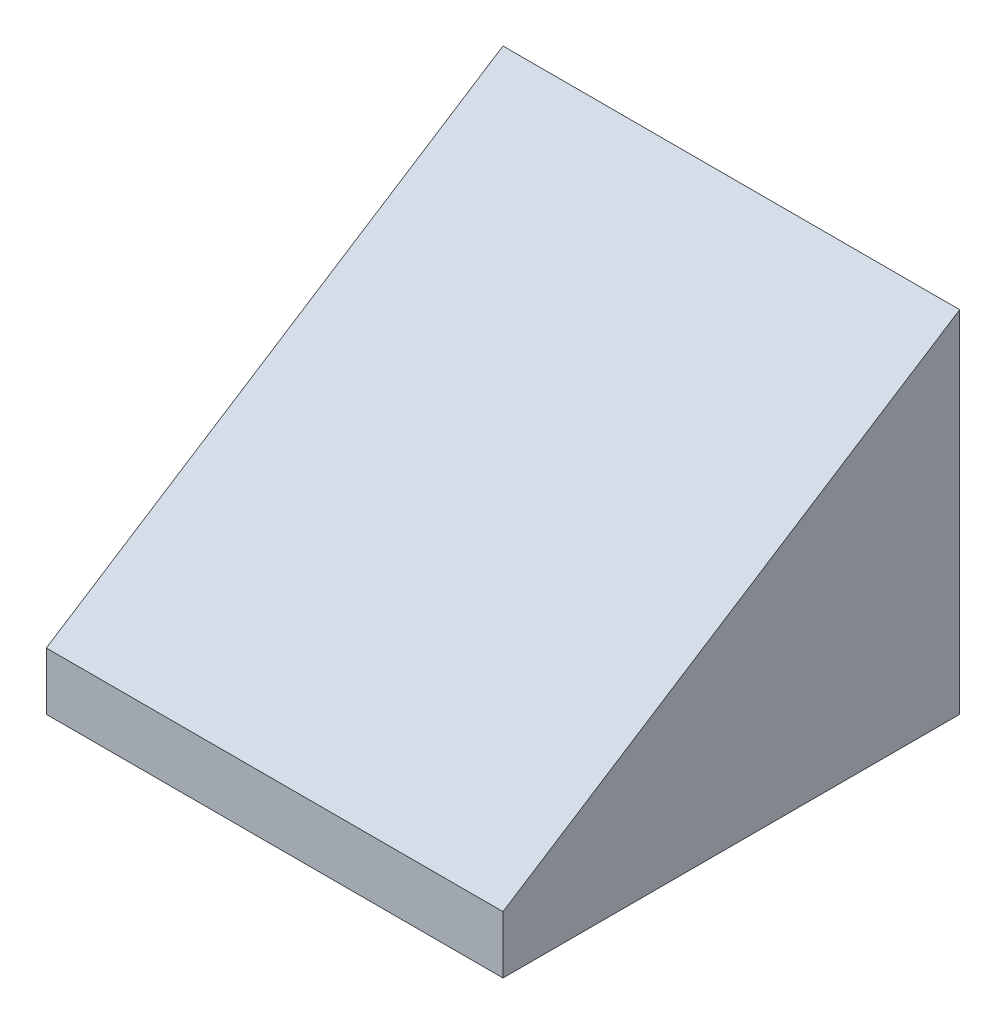
ISO-10303-21;
HEADER;
FILE_DESCRIPTION(('STEP AP214'),'2;1');
FILE_NAME('part.step','',(''),(''),'','','');
FILE_SCHEMA(('AUTOMOTIVE_DESIGN { 1 0 10303 214 1 1 1 1 }'));
ENDSEC;
DATA;
#1=APPLICATION_CONTEXT('core data for automotive mechanical design processes');
#2=APPLICATION_PROTOCOL_DEFINITION('international standard','automotive_design',2000,#1);
#3=PRODUCT_CONTEXT('',#1,'mechanical');
#4=PRODUCT('Part','Part','',(#3));
#5=PRODUCT_RELATED_PRODUCT_CATEGORY('part','',(#4));
#6=PRODUCT_DEFINITION_FORMATION('','',#4);
#7=PRODUCT_DEFINITION_CONTEXT('part definition',#1,'design');
#8=PRODUCT_DEFINITION('design','',#6,#7);
#9=PRODUCT_DEFINITION_SHAPE('','',#8);
#10=(LENGTH_UNIT() NAMED_UNIT(*) SI_UNIT(.MILLI.,.METRE.));
#11=(NAMED_UNIT(*) PLANE_ANGLE_UNIT() SI_UNIT($,.RADIAN.));
#12=(NAMED_UNIT(*) SI_UNIT($,.STERADIAN.) SOLID_ANGLE_UNIT());
#13=UNCERTAINTY_MEASURE_WITH_UNIT(LENGTH_MEASURE(1.E-05),#10,'distance_accuracy_value','');
#14=(GEOMETRIC_REPRESENTATION_CONTEXT(3) GLOBAL_UNCERTAINTY_ASSIGNED_CONTEXT((#13)) GLOBAL_UNIT_ASSIGNED_CONTEXT((#10,
#11,#12)) REPRESENTATION_CONTEXT('',''));
#15=CARTESIAN_POINT('',(0.,0.,0.));
#16=DIRECTION('',(0.,0.,1.));
#17=DIRECTION('',(1.,0.,0.));
#18=AXIS2_PLACEMENT_3D('',#15,#16,#17);
#19=CARTESIAN_POINT('',(-7.95,0.,0.));
#20=DIRECTION('',(0.,0.,1.));
#21=DIRECTION('',(0.,-1.,0.));
#22=AXIS2_PLACEMENT_3D('',#19,#20,#21);
#23=PLANE('',#22);
#24=DIRECTION('',(1.,0.,0.));
#25=VECTOR('',#24,1.);
#26=CARTESIAN_POINT('',(-17.7,-5.1,0.));
#27=LINE('',#26,#25);
#28=CARTESIAN_POINT('',(-7.95,-5.1,0.));
#29=VERTEX_POINT('',#28);
#30=CARTESIAN_POINT('',(0.,-5.1,0.));
#31=VERTEX_POINT('',#30);
#32=EDGE_CURVE('E56',#29,#31,#27,.T.);
#33=ORIENTED_EDGE('',*,*,#32,.F.);
#34=DIRECTION('',(0.,-1.,0.));
#35=VECTOR('',#34,1.);
#36=CARTESIAN_POINT('',(-7.95,0.,0.));
#37=LINE('',#36,#35);
#38=CARTESIAN_POINT('',(-7.95,-6.1,0.));
#39=VERTEX_POINT('',#38);
#40=EDGE_CURVE('E143',#29,#39,#37,.T.);
#41=ORIENTED_EDGE('',*,*,#40,.T.);
#42=DIRECTION('',(1.,0.,0.));
#43=VECTOR('',#42,1.);
#44=CARTESIAN_POINT('',(-7.95,-6.1,0.));
#45=LINE('',#44,#43);
#46=CARTESIAN_POINT('',(0.,-6.1,0.));
#47=VERTEX_POINT('',#46);
#48=EDGE_CURVE('E35',#39,#47,#45,.T.);
#49=ORIENTED_EDGE('',*,*,#48,.T.);
#50=DIRECTION('',(0.,-1.,0.));
#51=VECTOR('',#50,1.);
#52=CARTESIAN_POINT('',(0.,0.,0.));
#53=LINE('',#52,#51);
#54=EDGE_CURVE('E142',#31,#47,#53,.T.);
#55=ORIENTED_EDGE('',*,*,#54,.F.);
#56=EDGE_LOOP('',(#33,#41,#49,#55));
#57=FACE_BOUND('',#56,.T.);
#58=ADVANCED_FACE('F32',(#57),#23,.T.);
#59=CARTESIAN_POINT('',(-7.95,0.,-7.95));
#60=DIRECTION('',(0.,0.,-1.));
#61=DIRECTION('',(0.,1.,0.));
#62=AXIS2_PLACEMENT_3D('',#59,#60,#61);
#63=PLANE('',#62);
#64=DIRECTION('',(0.,1.,0.));
#65=VECTOR('',#64,1.);
#66=CARTESIAN_POINT('',(0.,0.,-7.95));
#67=LINE('',#66,#65);
#68=CARTESIAN_POINT('',(0.,-6.1,-7.95));
#69=VERTEX_POINT('',#68);
#70=CARTESIAN_POINT('',(0.,0.,-7.95));
#71=VERTEX_POINT('',#70);
#72=EDGE_CURVE('E146',#69,#71,#67,.T.);
#73=ORIENTED_EDGE('',*,*,#72,.F.);
#74=DIRECTION('',(1.,0.,0.));
#75=VECTOR('',#74,1.);
#76=CARTESIAN_POINT('',(-7.95,-6.1,-7.95));
#77=LINE('',#76,#75);
#78=CARTESIAN_POINT('',(-7.95,-6.1,-7.95));
#79=VERTEX_POINT('',#78);
#80=EDGE_CURVE('E40',#79,#69,#77,.T.);
#81=ORIENTED_EDGE('',*,*,#80,.F.);
#82=DIRECTION('',(0.,1.,0.));
#83=VECTOR('',#82,1.);
#84=CARTESIAN_POINT('',(-7.95,0.,-7.95));
#85=LINE('',#84,#83);
#86=CARTESIAN_POINT('',(-7.95,0.,-7.95));
#87=VERTEX_POINT('',#86);
#88=EDGE_CURVE('E149',#79,#87,#85,.T.);
#89=ORIENTED_EDGE('',*,*,#88,.T.);
#90=DIRECTION('',(1.,0.,0.));
#91=VECTOR('',#90,1.);
#92=CARTESIAN_POINT('',(-7.95,0.,-7.95));
#93=LINE('',#92,#91);
#94=EDGE_CURVE('E11',#87,#71,#93,.T.);
#95=ORIENTED_EDGE('',*,*,#94,.T.);
#96=EDGE_LOOP('',(#73,#81,#89,#95));
#97=FACE_BOUND('',#96,.T.);
#98=ADVANCED_FACE('F171',(#97),#63,.T.);
#99=CARTESIAN_POINT('',(-7.95,-6.1,0.));
#100=DIRECTION('',(0.,-1.,0.));
#101=DIRECTION('',(0.,0.,-1.));
#102=AXIS2_PLACEMENT_3D('',#99,#100,#101);
#103=PLANE('',#102);
#104=DIRECTION('',(0.,0.,1.));
#105=VECTOR('',#104,1.);
#106=CARTESIAN_POINT('',(-1.5,-6.1,-1.5));
#107=LINE('',#106,#105);
#108=CARTESIAN_POINT('',(-1.5,-6.1,-6.45));
#109=VERTEX_POINT('',#108);
#110=CARTESIAN_POINT('',(-1.5,-6.1,-1.5));
#111=VERTEX_POINT('',#110);
#112=EDGE_CURVE('E48',#109,#111,#107,.T.);
#113=ORIENTED_EDGE('',*,*,#112,.F.);
#114=DIRECTION('',(1.,0.,0.));
#115=VECTOR('',#114,1.);
#116=CARTESIAN_POINT('',(-6.45,-6.1,-6.45));
#117=LINE('',#116,#115);
#118=CARTESIAN_POINT('',(-6.45,-6.1,-6.45));
#119=VERTEX_POINT('',#118);
#120=EDGE_CURVE('E118',#119,#109,#117,.T.);
#121=ORIENTED_EDGE('',*,*,#120,.F.);
#122=DIRECTION('',(0.,0.,-1.));
#123=VECTOR('',#122,1.);
#124=CARTESIAN_POINT('',(-6.45,-6.1,-1.5));
#125=LINE('',#124,#123);
#126=CARTESIAN_POINT('',(-6.45,-6.1,-1.5));
#127=VERTEX_POINT('',#126);
#128=EDGE_CURVE('E121',#127,#119,#125,.T.);
#129=ORIENTED_EDGE('',*,*,#128,.F.);
#130=DIRECTION('',(-1.,0.,0.));
#131=VECTOR('',#130,1.);
#132=CARTESIAN_POINT('',(-6.45,-6.1,-1.5));
#133=LINE('',#132,#131);
#134=EDGE_CURVE('E127',#111,#127,#133,.T.);
#135=ORIENTED_EDGE('',*,*,#134,.F.);
#136=EDGE_LOOP('',(#113,#121,#129,#135));
#137=FACE_BOUND('',#136,.T.);
#138=DIRECTION('',(0.,0.,-1.));
#139=VECTOR('',#138,1.);
#140=CARTESIAN_POINT('',(0.,-6.1,0.));
#141=LINE('',#140,#139);
#142=EDGE_CURVE('E153',#47,#69,#141,.T.);
#143=ORIENTED_EDGE('',*,*,#142,.F.);
#144=ORIENTED_EDGE('',*,*,#48,.F.);
#145=DIRECTION('',(0.,0.,-1.));
#146=VECTOR('',#145,1.);
#147=CARTESIAN_POINT('',(-7.95,-6.1,0.));
#148=LINE('',#147,#146);
#149=EDGE_CURVE('E145',#39,#79,#148,.T.);
#150=ORIENTED_EDGE('',*,*,#149,.T.);
#151=ORIENTED_EDGE('',*,*,#80,.T.);
#152=EDGE_LOOP('',(#143,#144,#150,#151));
#153=FACE_BOUND('',#152,.T.);
#154=ADVANCED_FACE('F166',(#137,#153),#103,.T.);
#155=CARTESIAN_POINT('',(-7.95,-6.1,0.));
#156=DIRECTION('',(1.,0.,0.));
#157=DIRECTION('',(0.,0.,-1.));
#158=AXIS2_PLACEMENT_3D('',#155,#156,#157);
#159=PLANE('',#158);
#160=ORIENTED_EDGE('',*,*,#40,.F.);
#161=DIRECTION('',(0.,0.539954694283641,-0.841694082265676));
#162=VECTOR('',#161,1.);
#163=CARTESIAN_POINT('',(-7.95,-5.39155107187894,0.454476670870113));
#164=LINE('',#163,#162);
#165=EDGE_CURVE('E139',#29,#87,#164,.T.);
#166=ORIENTED_EDGE('',*,*,#165,.T.);
#167=ORIENTED_EDGE('',*,*,#88,.F.);
#168=ORIENTED_EDGE('',*,*,#149,.F.);
#169=EDGE_LOOP('',(#160,#166,#167,#168));
#170=FACE_BOUND('',#169,.T.);
#171=ADVANCED_FACE('F174',(#170),#159,.F.);
#172=CARTESIAN_POINT('',(0.,-6.1,0.));
#173=DIRECTION('',(1.,0.,0.));
#174=DIRECTION('',(0.,0.,-1.));
#175=AXIS2_PLACEMENT_3D('',#172,#173,#174);
#176=PLANE('',#175);
#177=DIRECTION('',(0.,0.539954694283641,-0.841694082265677));
#178=VECTOR('',#177,1.);
#179=CARTESIAN_POINT('',(0.,0.,-7.95));
#180=LINE('',#179,#178);
#181=EDGE_CURVE('E133',#31,#71,#180,.T.);
#182=ORIENTED_EDGE('',*,*,#181,.F.);
#183=ORIENTED_EDGE('',*,*,#54,.T.);
#184=ORIENTED_EDGE('',*,*,#142,.T.);
#185=ORIENTED_EDGE('',*,*,#72,.T.);
#186=EDGE_LOOP('',(#182,#183,#184,#185));
#187=FACE_BOUND('',#186,.T.);
#188=ADVANCED_FACE('F168',(#187),#176,.T.);
#189=CARTESIAN_POINT('',(-17.7,0.,-7.95));
#190=DIRECTION('',(0.,-0.841694082265676,-0.539954694283641));
#191=DIRECTION('',(0.,0.539954694283641,-0.841694082265676));
#192=AXIS2_PLACEMENT_3D('',#189,#190,#191);
#193=PLANE('',#192);
#194=ORIENTED_EDGE('',*,*,#32,.T.);
#195=ORIENTED_EDGE('',*,*,#181,.T.);
#196=ORIENTED_EDGE('',*,*,#94,.F.);
#197=ORIENTED_EDGE('',*,*,#165,.F.);
#198=EDGE_LOOP('',(#194,#195,#196,#197));
#199=FACE_BOUND('',#198,.T.);
#200=ADVANCED_FACE('F169',(#199),#193,.F.);
#201=CARTESIAN_POINT('',(-1.5,-4.4,-1.5));
#202=DIRECTION('',(1.,0.,0.));
#203=DIRECTION('',(0.,0.,-1.));
#204=AXIS2_PLACEMENT_3D('',#201,#202,#203);
#205=PLANE('',#204);
#206=ORIENTED_EDGE('',*,*,#112,.T.);
#207=DIRECTION('',(0.,-1.,0.));
#208=VECTOR('',#207,1.);
#209=CARTESIAN_POINT('',(-1.5,-4.4,-1.5));
#210=LINE('',#209,#208);
#211=CARTESIAN_POINT('',(-1.5,-4.4,-1.5));
#212=VERTEX_POINT('',#211);
#213=EDGE_CURVE('E96',#212,#111,#210,.T.);
#214=ORIENTED_EDGE('',*,*,#213,.F.);
#215=DIRECTION('',(0.,0.,1.));
#216=VECTOR('',#215,1.);
#217=CARTESIAN_POINT('',(-1.5,-4.4,-1.5));
#218=LINE('',#217,#216);
#219=CARTESIAN_POINT('',(-1.5,-4.4,-6.45));
#220=VERTEX_POINT('',#219);
#221=EDGE_CURVE('E100',#220,#212,#218,.T.);
#222=ORIENTED_EDGE('',*,*,#221,.F.);
#223=DIRECTION('',(0.,-1.,0.));
#224=VECTOR('',#223,1.);
#225=CARTESIAN_POINT('',(-1.5,-4.4,-6.45));
#226=LINE('',#225,#224);
#227=EDGE_CURVE('E131',#220,#109,#226,.T.);
#228=ORIENTED_EDGE('',*,*,#227,.T.);
#229=EDGE_LOOP('',(#206,#214,#222,#228));
#230=FACE_BOUND('',#229,.T.);
#231=ADVANCED_FACE('F98',(#230),#205,.F.);
#232=CARTESIAN_POINT('',(-6.45,-4.4,-6.45));
#233=DIRECTION('',(0.,0.,-1.));
#234=DIRECTION('',(-1.,0.,0.));
#235=AXIS2_PLACEMENT_3D('',#232,#233,#234);
#236=PLANE('',#235);
#237=ORIENTED_EDGE('',*,*,#120,.T.);
#238=ORIENTED_EDGE('',*,*,#227,.F.);
#239=DIRECTION('',(1.,0.,0.));
#240=VECTOR('',#239,1.);
#241=CARTESIAN_POINT('',(-6.45,-4.4,-6.45));
#242=LINE('',#241,#240);
#243=CARTESIAN_POINT('',(-6.45,-4.4,-6.45));
#244=VERTEX_POINT('',#243);
#245=EDGE_CURVE('E106',#244,#220,#242,.T.);
#246=ORIENTED_EDGE('',*,*,#245,.F.);
#247=DIRECTION('',(0.,-1.,0.));
#248=VECTOR('',#247,1.);
#249=CARTESIAN_POINT('',(-6.45,-4.4,-6.45));
#250=LINE('',#249,#248);
#251=EDGE_CURVE('E134',#244,#119,#250,.T.);
#252=ORIENTED_EDGE('',*,*,#251,.T.);
#253=EDGE_LOOP('',(#237,#238,#246,#252));
#254=FACE_BOUND('',#253,.T.);
#255=ADVANCED_FACE('F210',(#254),#236,.F.);
#256=CARTESIAN_POINT('',(-6.45,-4.4,-1.5));
#257=DIRECTION('',(-1.,0.,0.));
#258=DIRECTION('',(0.,0.,1.));
#259=AXIS2_PLACEMENT_3D('',#256,#257,#258);
#260=PLANE('',#259);
#261=ORIENTED_EDGE('',*,*,#128,.T.);
#262=ORIENTED_EDGE('',*,*,#251,.F.);
#263=DIRECTION('',(0.,0.,-1.));
#264=VECTOR('',#263,1.);
#265=CARTESIAN_POINT('',(-6.45,-4.4,-1.5));
#266=LINE('',#265,#264);
#267=CARTESIAN_POINT('',(-6.45,-4.4,-1.5));
#268=VERTEX_POINT('',#267);
#269=EDGE_CURVE('E114',#268,#244,#266,.T.);
#270=ORIENTED_EDGE('',*,*,#269,.F.);
#271=DIRECTION('',(0.,-1.,0.));
#272=VECTOR('',#271,1.);
#273=CARTESIAN_POINT('',(-6.45,-4.4,-1.5));
#274=LINE('',#273,#272);
#275=EDGE_CURVE('E105',#268,#127,#274,.T.);
#276=ORIENTED_EDGE('',*,*,#275,.T.);
#277=EDGE_LOOP('',(#261,#262,#270,#276));
#278=FACE_BOUND('',#277,.T.);
#279=ADVANCED_FACE('F219',(#278),#260,.F.);
#280=CARTESIAN_POINT('',(-6.45,-4.4,-1.5));
#281=DIRECTION('',(0.,0.,1.));
#282=DIRECTION('',(1.,0.,0.));
#283=AXIS2_PLACEMENT_3D('',#280,#281,#282);
#284=PLANE('',#283);
#285=ORIENTED_EDGE('',*,*,#134,.T.);
#286=ORIENTED_EDGE('',*,*,#275,.F.);
#287=DIRECTION('',(-1.,0.,0.));
#288=VECTOR('',#287,1.);
#289=CARTESIAN_POINT('',(-6.45,-4.4,-1.5));
#290=LINE('',#289,#288);
#291=EDGE_CURVE('E109',#212,#268,#290,.T.);
#292=ORIENTED_EDGE('',*,*,#291,.F.);
#293=ORIENTED_EDGE('',*,*,#213,.T.);
#294=EDGE_LOOP('',(#285,#286,#292,#293));
#295=FACE_BOUND('',#294,.T.);
#296=ADVANCED_FACE('F110',(#295),#284,.F.);
#297=CARTESIAN_POINT('',(-1.5,-4.4,-6.45));
#298=DIRECTION('',(0.,-1.,0.));
#299=DIRECTION('',(0.,0.,-1.));
#300=AXIS2_PLACEMENT_3D('',#297,#298,#299);
#301=PLANE('',#300);
#302=ORIENTED_EDGE('',*,*,#221,.T.);
#303=ORIENTED_EDGE('',*,*,#291,.T.);
#304=ORIENTED_EDGE('',*,*,#269,.T.);
#305=ORIENTED_EDGE('',*,*,#245,.T.);
#306=EDGE_LOOP('',(#302,#303,#304,#305));
#307=FACE_BOUND('',#306,.T.);
#308=ADVANCED_FACE('F116',(#307),#301,.T.);
#309=CLOSED_SHELL('',(#58,#98,#154,#171,#188,#200,#231,#255,#279,#296,#308));
#310=MANIFOLD_SOLID_BREP('B2',#309);
#311=ADVANCED_BREP_SHAPE_REPRESENTATION('',(#18,#310),#14);
#312=SHAPE_DEFINITION_REPRESENTATION(#9,#311);
ENDSEC;
END-ISO-10303-21;
